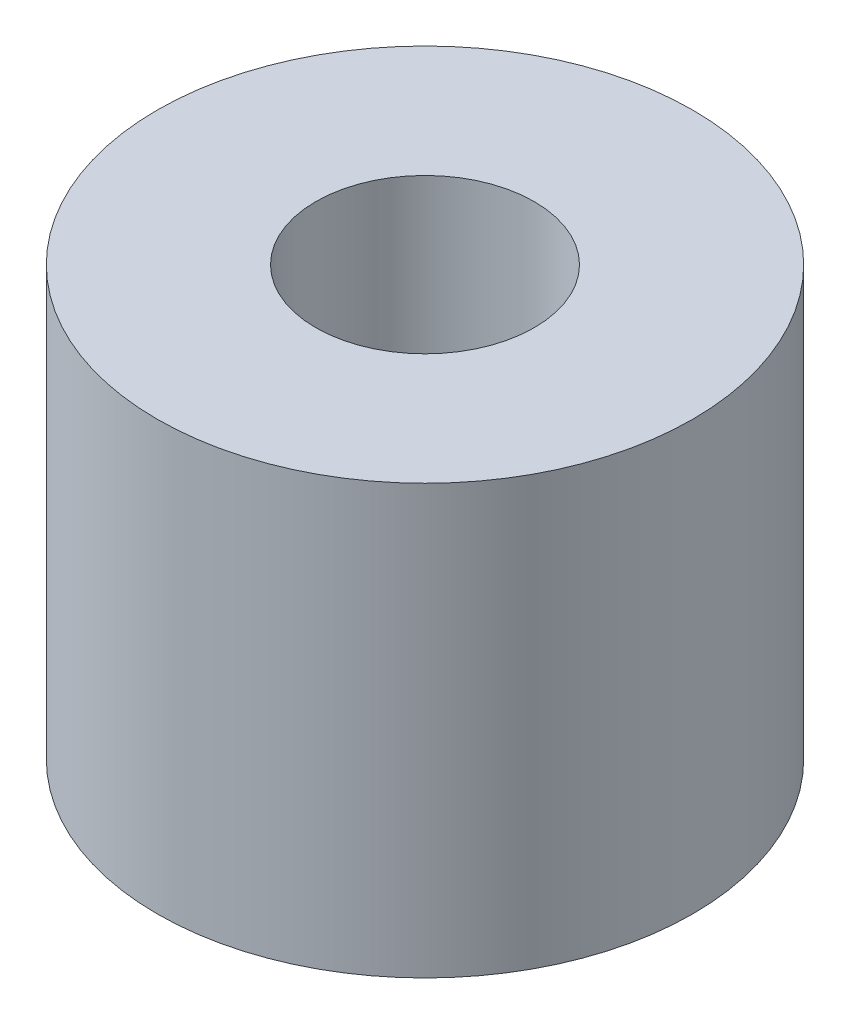
ISO-10303-21;
HEADER;
FILE_DESCRIPTION(('STEP AP214'),'2;1');
FILE_NAME('part.step','',(''),(''),'','','');
FILE_SCHEMA(('AUTOMOTIVE_DESIGN { 1 0 10303 214 1 1 1 1 }'));
ENDSEC;
DATA;
#1=APPLICATION_CONTEXT('core data for automotive mechanical design processes');
#2=APPLICATION_PROTOCOL_DEFINITION('international standard','automotive_design',2000,#1);
#3=PRODUCT_CONTEXT('',#1,'mechanical');
#4=PRODUCT('Part','Part','',(#3));
#5=PRODUCT_RELATED_PRODUCT_CATEGORY('part','',(#4));
#6=PRODUCT_DEFINITION_FORMATION('','',#4);
#7=PRODUCT_DEFINITION_CONTEXT('part definition',#1,'design');
#8=PRODUCT_DEFINITION('design','',#6,#7);
#9=PRODUCT_DEFINITION_SHAPE('','',#8);
#10=(LENGTH_UNIT() NAMED_UNIT(*) SI_UNIT(.MILLI.,.METRE.));
#11=(NAMED_UNIT(*) PLANE_ANGLE_UNIT() SI_UNIT($,.RADIAN.));
#12=(NAMED_UNIT(*) SI_UNIT($,.STERADIAN.) SOLID_ANGLE_UNIT());
#13=UNCERTAINTY_MEASURE_WITH_UNIT(LENGTH_MEASURE(1.E-05),#10,'distance_accuracy_value','');
#14=(GEOMETRIC_REPRESENTATION_CONTEXT(3) GLOBAL_UNCERTAINTY_ASSIGNED_CONTEXT((#13)) GLOBAL_UNIT_ASSIGNED_CONTEXT((#10,
#11,#12)) REPRESENTATION_CONTEXT('',''));
#15=CARTESIAN_POINT('',(0.,0.,0.));
#16=DIRECTION('',(0.,0.,1.));
#17=DIRECTION('',(1.,0.,0.));
#18=AXIS2_PLACEMENT_3D('',#15,#16,#17);
#19=CARTESIAN_POINT('',(0.,0.,0.));
#20=DIRECTION('',(0.,1.,0.));
#21=DIRECTION('',(0.,0.,1.));
#22=AXIS2_PLACEMENT_3D('',#19,#20,#21);
#23=CYLINDRICAL_SURFACE('',#22,12.5);
#24=CARTESIAN_POINT('',(0.,0.,0.));
#25=DIRECTION('',(0.,1.,0.));
#26=DIRECTION('',(0.,0.,1.));
#27=AXIS2_PLACEMENT_3D('',#24,#25,#26);
#28=CIRCLE('',#27,12.5);
#29=CARTESIAN_POINT('',(0.,0.,12.5));
#30=VERTEX_POINT('',#29);
#31=EDGE_CURVE('E10',#30,#30,#28,.T.);
#32=ORIENTED_EDGE('',*,*,#31,.T.);
#33=EDGE_LOOP('',(#32));
#34=FACE_BOUND('',#33,.T.);
#35=CARTESIAN_POINT('',(0.,20.,0.));
#36=DIRECTION('',(0.,1.,0.));
#37=DIRECTION('',(0.,0.,1.));
#38=AXIS2_PLACEMENT_3D('',#35,#36,#37);
#39=CIRCLE('',#38,12.5);
#40=CARTESIAN_POINT('',(0.,20.,12.5));
#41=VERTEX_POINT('',#40);
#42=EDGE_CURVE('E47',#41,#41,#39,.T.);
#43=ORIENTED_EDGE('',*,*,#42,.F.);
#44=EDGE_LOOP('',(#43));
#45=FACE_BOUND('',#44,.T.);
#46=ADVANCED_FACE('F33',(#34,#45),#23,.T.);
#47=CARTESIAN_POINT('',(-5.1,0.,0.));
#48=DIRECTION('',(0.,-1.,0.));
#49=DIRECTION('',(0.,0.,-1.));
#50=AXIS2_PLACEMENT_3D('',#47,#48,#49);
#51=PLANE('',#50);
#52=CARTESIAN_POINT('',(0.,0.,0.));
#53=DIRECTION('',(0.,1.,0.));
#54=DIRECTION('',(0.,0.,1.));
#55=AXIS2_PLACEMENT_3D('',#52,#53,#54);
#56=CIRCLE('',#55,5.1);
#57=CARTESIAN_POINT('',(0.,0.,5.1));
#58=VERTEX_POINT('',#57);
#59=EDGE_CURVE('E39',#58,#58,#56,.T.);
#60=ORIENTED_EDGE('',*,*,#59,.T.);
#61=EDGE_LOOP('',(#60));
#62=FACE_BOUND('',#61,.T.);
#63=ORIENTED_EDGE('',*,*,#31,.F.);
#64=EDGE_LOOP('',(#63));
#65=FACE_BOUND('',#64,.T.);
#66=ADVANCED_FACE('F57',(#62,#65),#51,.T.);
#67=CARTESIAN_POINT('',(0.,0.,0.));
#68=DIRECTION('',(0.,1.,0.));
#69=DIRECTION('',(0.,0.,1.));
#70=AXIS2_PLACEMENT_3D('',#67,#68,#69);
#71=CYLINDRICAL_SURFACE('',#70,5.1);
#72=CARTESIAN_POINT('',(0.,20.,0.));
#73=DIRECTION('',(0.,1.,0.));
#74=DIRECTION('',(0.,0.,1.));
#75=AXIS2_PLACEMENT_3D('',#72,#73,#74);
#76=CIRCLE('',#75,5.1);
#77=CARTESIAN_POINT('',(0.,20.,5.1));
#78=VERTEX_POINT('',#77);
#79=EDGE_CURVE('E43',#78,#78,#76,.T.);
#80=ORIENTED_EDGE('',*,*,#79,.T.);
#81=EDGE_LOOP('',(#80));
#82=FACE_BOUND('',#81,.T.);
#83=ORIENTED_EDGE('',*,*,#59,.F.);
#84=EDGE_LOOP('',(#83));
#85=FACE_BOUND('',#84,.T.);
#86=ADVANCED_FACE('F61',(#82,#85),#71,.F.);
#87=CARTESIAN_POINT('',(-5.1,20.,0.));
#88=DIRECTION('',(0.,1.,0.));
#89=DIRECTION('',(0.,0.,1.));
#90=AXIS2_PLACEMENT_3D('',#87,#88,#89);
#91=PLANE('',#90);
#92=ORIENTED_EDGE('',*,*,#42,.T.);
#93=EDGE_LOOP('',(#92));
#94=FACE_BOUND('',#93,.T.);
#95=ORIENTED_EDGE('',*,*,#79,.F.);
#96=EDGE_LOOP('',(#95));
#97=FACE_BOUND('',#96,.T.);
#98=ADVANCED_FACE('F53',(#94,#97),#91,.T.);
#99=CLOSED_SHELL('',(#46,#66,#86,#98));
#100=MANIFOLD_SOLID_BREP('B2',#99);
#101=ADVANCED_BREP_SHAPE_REPRESENTATION('',(#18,#100),#14);
#102=SHAPE_DEFINITION_REPRESENTATION(#9,#101);
ENDSEC;
END-ISO-10303-21;
